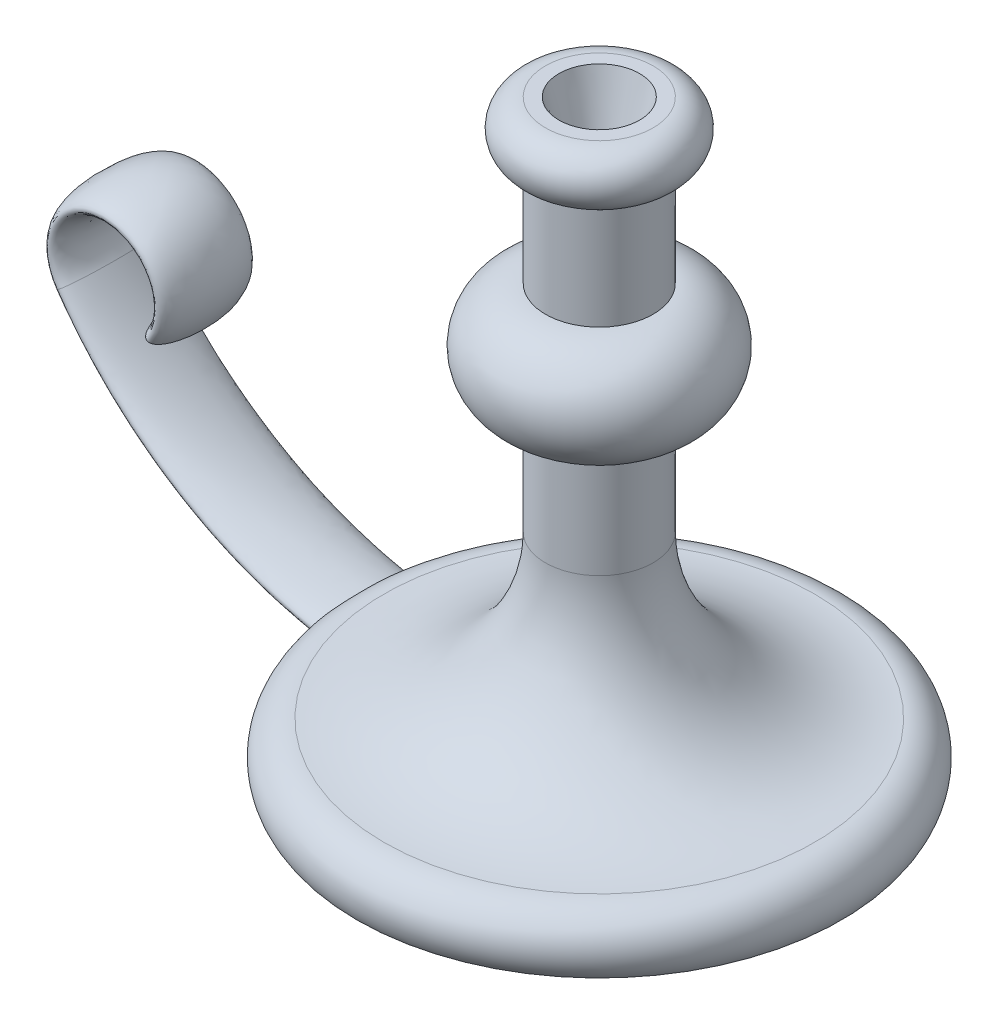
ISO-10303-21;
HEADER;
FILE_DESCRIPTION(('STEP AP214'),'2;1');
FILE_NAME('part.step','',(''),(''),'','','');
FILE_SCHEMA(('AUTOMOTIVE_DESIGN { 1 0 10303 214 1 1 1 1 }'));
ENDSEC;
DATA;
#1=APPLICATION_CONTEXT('core data for automotive mechanical design processes');
#2=APPLICATION_PROTOCOL_DEFINITION('international standard','automotive_design',2000,#1);
#3=PRODUCT_CONTEXT('',#1,'mechanical');
#4=PRODUCT('Part','Part','',(#3));
#5=PRODUCT_RELATED_PRODUCT_CATEGORY('part','',(#4));
#6=PRODUCT_DEFINITION_FORMATION('','',#4);
#7=PRODUCT_DEFINITION_CONTEXT('part definition',#1,'design');
#8=PRODUCT_DEFINITION('design','',#6,#7);
#9=PRODUCT_DEFINITION_SHAPE('','',#8);
#10=(LENGTH_UNIT() NAMED_UNIT(*) SI_UNIT(.MILLI.,.METRE.));
#11=(NAMED_UNIT(*) PLANE_ANGLE_UNIT() SI_UNIT($,.RADIAN.));
#12=(NAMED_UNIT(*) SI_UNIT($,.STERADIAN.) SOLID_ANGLE_UNIT());
#13=UNCERTAINTY_MEASURE_WITH_UNIT(LENGTH_MEASURE(1.E-05),#10,'distance_accuracy_value','');
#14=(GEOMETRIC_REPRESENTATION_CONTEXT(3) GLOBAL_UNCERTAINTY_ASSIGNED_CONTEXT((#13)) GLOBAL_UNIT_ASSIGNED_CONTEXT((#10,
#11,#12)) REPRESENTATION_CONTEXT('',''));
#15=CARTESIAN_POINT('',(0.,0.,0.));
#16=DIRECTION('',(0.,0.,1.));
#17=DIRECTION('',(1.,0.,0.));
#18=AXIS2_PLACEMENT_3D('',#15,#16,#17);
#19=CARTESIAN_POINT('',(0.,7.50000000000001,0.));
#20=DIRECTION('',(0.,-1.,0.));
#21=DIRECTION('',(0.,0.,-1.));
#22=AXIS2_PLACEMENT_3D('',#19,#20,#21);
#23=TOROIDAL_SURFACE('',#22,80.,12.5);
#24=CARTESIAN_POINT('',(0.,0.,0.));
#25=DIRECTION('',(0.,-1.,0.));
#26=DIRECTION('',(0.,0.,-1.));
#27=AXIS2_PLACEMENT_3D('',#24,#25,#26);
#28=CIRCLE('',#27,90.);
#29=CARTESIAN_POINT('',(0.,0.,-90.));
#30=VERTEX_POINT('',#29);
#31=EDGE_CURVE('E76',#30,#30,#28,.T.);
#32=ORIENTED_EDGE('',*,*,#31,.F.);
#33=EDGE_LOOP('',(#32));
#34=FACE_BOUND('',#33,.T.);
#35=CARTESIAN_POINT('',(0.,20.,0.));
#36=DIRECTION('',(0.,-1.,0.));
#37=DIRECTION('',(0.,0.,-1.));
#38=AXIS2_PLACEMENT_3D('',#35,#36,#37);
#39=CIRCLE('',#38,80.);
#40=CARTESIAN_POINT('',(0.,20.,-80.));
#41=VERTEX_POINT('',#40);
#42=EDGE_CURVE('E72',#41,#41,#39,.T.);
#43=ORIENTED_EDGE('',*,*,#42,.T.);
#44=EDGE_LOOP('',(#43));
#45=FACE_BOUND('',#44,.T.);
#46=CARTESIAN_POINT('',(-89.5597422043342,12.9414346567555,17.5));
#47=CARTESIAN_POINT('',(-89.5807278946486,12.8988393157081,17.5000019534777));
#48=CARTESIAN_POINT('',(-89.6018125795404,12.8563039357769,17.4977816975197));
#49=CARTESIAN_POINT('',(-89.6440155813563,12.771693833937,17.489002543543));
#50=CARTESIAN_POINT('',(-89.6651339056647,12.7296192360718,17.4824425050804));
#51=CARTESIAN_POINT('',(-89.7283289297819,12.6045076597417,17.4565216692094));
#52=CARTESIAN_POINT('',(-89.7702246464785,12.5226255894254,17.4309204730635));
#53=CARTESIAN_POINT('',(-89.8644276523311,12.3407735771965,17.3563532007827));
#54=CARTESIAN_POINT('',(-89.9162117483189,12.242484901666,17.3027527423027));
#55=CARTESIAN_POINT('',(-90.0163878681401,12.0551458272008,17.178826321144));
#56=CARTESIAN_POINT('',(-90.0647710548456,11.966119226993,17.1084587296403));
#57=CARTESIAN_POINT('',(-90.1524531790238,11.8069845229249,16.9652391551481));
#58=CARTESIAN_POINT('',(-90.1921458014336,11.7358878994478,16.8936963434586));
#59=CARTESIAN_POINT('',(-90.2690886261224,11.5996259068224,16.7438969488311));
#60=CARTESIAN_POINT('',(-90.3063367280021,11.5344656201532,16.665634722265));
#61=CARTESIAN_POINT('',(-90.3786756485819,11.4092540815105,16.5039763875565));
#62=CARTESIAN_POINT('',(-90.4137624747614,11.349212210629,16.4205713158719));
#63=CARTESIAN_POINT('',(-90.4819450166471,11.2336894025401,16.2499454917114));
#64=CARTESIAN_POINT('',(-90.5150413047902,11.1782071523834,16.162725848809));
#65=CARTESIAN_POINT('',(-90.5839705930101,11.0637251825689,15.9728919395737));
#66=CARTESIAN_POINT('',(-90.6195406839562,11.0053156128849,15.8698282905888));
#67=CARTESIAN_POINT('',(-90.6886668526269,10.8929143897207,15.6606649910659));
#68=CARTESIAN_POINT('',(-90.7222226971282,10.8389232475744,15.5545649910506));
#69=CARTESIAN_POINT('',(-90.787486486134,10.7348751403118,15.3401290691865));
#70=CARTESIAN_POINT('',(-90.8191972688173,10.684812089084,15.2317969483067));
#71=CARTESIAN_POINT('',(-90.881005962979,10.5880683385414,15.0131968985225));
#72=CARTESIAN_POINT('',(-90.9111039714557,10.5413874357516,14.9029290865687));
#73=CARTESIAN_POINT('',(-90.979897363352,10.4355491517098,14.6427529331226));
#74=CARTESIAN_POINT('',(-91.0180072010883,10.377593665576,14.4922012075481));
#75=CARTESIAN_POINT('',(-91.0918875553169,10.2663462891691,14.1888070722871));
#76=CARTESIAN_POINT('',(-91.1276577411367,10.2130550577558,14.0359643425398));
#77=CARTESIAN_POINT('',(-91.1971197458645,10.1105127689611,13.7282685712582));
#78=CARTESIAN_POINT('',(-91.2308091946811,10.0612662985098,13.573413471871));
#79=CARTESIAN_POINT('',(-91.2962483962878,9.96642044574794,13.262180104172));
#80=CARTESIAN_POINT('',(-91.3279980241889,9.92082129819988,13.1058017385396));
#81=CARTESIAN_POINT('',(-91.4205951755327,9.78887458660793,12.6346162266685));
#82=CARTESIAN_POINT('',(-91.4787589060981,9.7074247697959,12.3179025042442));
#83=CARTESIAN_POINT('',(-91.5890957852254,9.55493826130148,11.6792188898602));
#84=CARTESIAN_POINT('',(-91.641236506382,9.48395741425902,11.357230318611));
#85=CARTESIAN_POINT('',(-91.7397682682944,9.35136221163193,10.7107316640823));
#86=CARTESIAN_POINT('',(-91.7861636672357,9.28974074823241,10.3862236929834));
#87=CARTESIAN_POINT('',(-91.8736976604511,9.17463718318048,9.73512886653574));
#88=CARTESIAN_POINT('',(-91.9148370779328,9.12115380666532,9.4085423451682));
#89=CARTESIAN_POINT('',(-91.9930777751443,9.02031209920314,8.74630339912618));
#90=CARTESIAN_POINT('',(-92.0300669877613,8.97311921137155,8.41061269264342));
#91=CARTESIAN_POINT('',(-92.0991833927575,8.88559842477429,7.73783252743949));
#92=CARTESIAN_POINT('',(-92.1313104056235,8.84527077946747,7.40074301754615));
#93=CARTESIAN_POINT('',(-92.1909161961866,8.77092313439264,6.7253714235535));
#94=CARTESIAN_POINT('',(-92.2183937480205,8.73690479789178,6.38708904887196));
#95=CARTESIAN_POINT('',(-92.2688480816039,8.67476840304496,5.70964427774295));
#96=CARTESIAN_POINT('',(-92.2918247141674,8.64665054027188,5.37048185250304));
#97=CARTESIAN_POINT('',(-92.3540877228586,8.57076604630483,4.35367181244673));
#98=CARTESIAN_POINT('',(-92.3868571977359,8.53128338370551,3.67498389641651));
#99=CARTESIAN_POINT('',(-92.4356134743347,8.47274161832891,2.31614711504074));
#100=CARTESIAN_POINT('',(-92.4515998737812,8.4536830050971,1.63599821506828));
#101=CARTESIAN_POINT('',(-92.466120047878,8.43637339284848,0.357955102331979));
#102=CARTESIAN_POINT('',(-92.4665389208555,8.43587490179702,-0.239888856143629));
#103=CARTESIAN_POINT('',(-92.4546362797529,8.45006241260825,-1.43536153859163));
#104=CARTESIAN_POINT('',(-92.4423128974783,8.4647506410584,-2.03299021814841));
#105=CARTESIAN_POINT('',(-92.4047541650815,8.50976680779925,-3.22745109478544));
#106=CARTESIAN_POINT('',(-92.379514731688,8.54009969200433,-3.82428298010725));
#107=CARTESIAN_POINT('',(-92.3157217367253,8.61743320229672,-5.01694606233263));
#108=CARTESIAN_POINT('',(-92.2771508465328,8.66445552395915,-5.61277493756133));
#109=CARTESIAN_POINT('',(-92.1861026743767,8.77678784246252,-6.80153886380944));
#110=CARTESIAN_POINT('',(-92.1336290020919,8.84209309262495,-7.39447462535096));
#111=CARTESIAN_POINT('',(-92.0437550848418,8.95574227206708,-8.2805522982052));
#112=CARTESIAN_POINT('',(-92.0119455213755,8.9962289455201,-8.57528682166734));
#113=CARTESIAN_POINT('',(-91.9444204496405,9.08291539794885,-9.16346094428892));
#114=CARTESIAN_POINT('',(-91.9087051114864,9.12911492811454,-9.45690059926722));
#115=CARTESIAN_POINT('',(-91.8331309715697,9.22782929334065,-10.0422906036684));
#116=CARTESIAN_POINT('',(-91.7932707518513,9.28034629056379,-10.3342404073469));
#117=CARTESIAN_POINT('',(-91.7091179167369,9.39245062081628,-10.9161852811054));
#118=CARTESIAN_POINT('',(-91.6648247441272,9.45203884286027,-11.2061801005453));
#119=CARTESIAN_POINT('',(-91.571392572748,9.57931645333877,-11.783819165817));
#120=CARTESIAN_POINT('',(-91.5222504482681,9.64701107336923,-12.0714617643074));
#121=CARTESIAN_POINT('',(-91.4186796874406,9.79172730085905,-12.6430805537633));
#122=CARTESIAN_POINT('',(-91.3642572573635,9.86873798424095,-12.9270606150356));
#123=CARTESIAN_POINT('',(-91.2493765391174,10.033952974788,-13.4904217181467));
#124=CARTESIAN_POINT('',(-91.1889212109096,10.1221517983454,-13.7698049377449));
#125=CARTESIAN_POINT('',(-91.0929373870873,10.2648274882363,-14.1839125047648));
#126=CARTESIAN_POINT('',(-91.0600757486262,10.3140904181849,-14.3210581267388));
#127=CARTESIAN_POINT('',(-90.9923938569386,10.4165511027192,-14.593376347765));
#128=CARTESIAN_POINT('',(-90.9575737807135,10.4697485018483,-14.7285491237346));
#129=CARTESIAN_POINT('',(-90.8810851838776,10.5878451344079,-15.0138774923679));
#130=CARTESIAN_POINT('',(-90.8391147723957,10.6533666208412,-15.1636969104749));
#131=CARTESIAN_POINT('',(-90.7519625692612,10.7912189771815,-15.4593295355901));
#132=CARTESIAN_POINT('',(-90.7067794219568,10.8635527258308,-15.605141014985));
#133=CARTESIAN_POINT('',(-90.6128939496974,11.0160439629677,-15.8905749729623));
#134=CARTESIAN_POINT('',(-90.5642084544311,11.0961646105685,-16.0302224467125));
#135=CARTESIAN_POINT('',(-90.4624897667354,11.2662530107872,-16.3016394850687));
#136=CARTESIAN_POINT('',(-90.4094613083907,11.3562100760681,-16.4334173639363));
#137=CARTESIAN_POINT('',(-90.3114276481005,11.5255085385047,-16.6553108138959));
#138=CARTESIAN_POINT('',(-90.2675273757817,11.6022608890605,-16.747864447136));
#139=CARTESIAN_POINT('',(-90.1761749534327,11.7643292238686,-16.9236630994732));
#140=CARTESIAN_POINT('',(-90.1287172073379,11.849658775493,-17.0068929161981));
#141=CARTESIAN_POINT('',(-90.0292807633427,12.0313291797368,-17.160728121925));
#142=CARTESIAN_POINT('',(-89.9772518064338,12.1277974407354,-17.2311575389091));
#143=CARTESIAN_POINT('',(-89.8965437818878,12.2800613987941,-17.3212876850735));
#144=CARTESIAN_POINT('',(-89.8692277989253,12.3320164153137,-17.3487242132161));
#145=CARTESIAN_POINT('',(-89.8138320311431,12.4382955168478,-17.397521114568));
#146=CARTESIAN_POINT('',(-89.7857527202502,12.4926181439798,-17.4188851676711));
#147=CARTESIAN_POINT('',(-89.7185869780336,12.6237048005599,-17.4611772226903));
#148=CARTESIAN_POINT('',(-89.6792533408886,12.7013692224276,-17.4790502108363));
#149=CARTESIAN_POINT('',(-89.6005512815564,12.8586256339485,-17.4997317533413));
#150=CARTESIAN_POINT('',(-89.5611829132233,12.9382160139949,-17.5025524785485));
#151=CARTESIAN_POINT('',(-89.4835317885697,13.0969633423244,-17.4927372657774));
#152=CARTESIAN_POINT('',(-89.4452490812937,13.1761202708964,-17.4801006306501));
#153=CARTESIAN_POINT('',(-89.3707047667355,13.3318071774563,-17.440649407729));
#154=CARTESIAN_POINT('',(-89.3344452993772,13.4083343423531,-17.4138201116179));
#155=CARTESIAN_POINT('',(-89.2510611220235,13.5858554385683,-17.3357126521072));
#156=CARTESIAN_POINT('',(-89.2050998650832,13.684982377722,-17.2790047620841));
#157=CARTESIAN_POINT('',(-89.1180744174556,13.8744276311819,-17.1491670423826));
#158=CARTESIAN_POINT('',(-89.0770301058259,13.9647099356686,-17.0759737821298));
#159=CARTESIAN_POINT('',(-89.0037033744711,14.1271434857571,-16.9270577307039));
#160=CARTESIAN_POINT('',(-88.9709541551903,14.2001945680732,-16.8525208708986));
#161=CARTESIAN_POINT('',(-88.908496842619,14.3401811690449,-16.697029269211));
#162=CARTESIAN_POINT('',(-88.8787841266134,14.4071259665769,-16.6160846261892));
#163=CARTESIAN_POINT('',(-88.8217814388549,14.5359995630883,-16.4490709627677));
#164=CARTESIAN_POINT('',(-88.7944998605826,14.5979109242412,-16.362985782321));
#165=CARTESIAN_POINT('',(-88.7420667437369,14.717173406466,-16.187069787363));
#166=CARTESIAN_POINT('',(-88.7169159331092,14.7745229686601,-16.097237708295));
#167=CARTESIAN_POINT('',(-88.6682699235336,14.8855899090513,-15.9140699306461));
#168=CARTESIAN_POINT('',(-88.6447869137156,14.9392804489426,-15.8207148279058));
#169=CARTESIAN_POINT('',(-88.5993971939427,15.0431008843882,-15.6316626961432));
#170=CARTESIAN_POINT('',(-88.5774907604158,15.0932301555102,-15.5359652603523));
#171=CARTESIAN_POINT('',(-88.513751478622,15.2390285874187,-15.2458062448786));
#172=CARTESIAN_POINT('',(-88.4739596847913,15.329968547736,-15.0485147207846));
#173=CARTESIAN_POINT('',(-88.3985337506615,15.5017775203626,-14.6487152633386));
#174=CARTESIAN_POINT('',(-88.3629029634839,15.5826384140041,-14.4462032813472));
#175=CARTESIAN_POINT('',(-88.2948356711212,15.7363066128672,-14.0365764701687));
#176=CARTESIAN_POINT('',(-88.2624142295169,15.8090761199817,-13.8294450545347));
#177=CARTESIAN_POINT('',(-88.2003835751381,15.9473648801957,-13.4126289871757));
#178=CARTESIAN_POINT('',(-88.1707714189814,16.0128917338223,-13.2029472733579));
#179=CARTESIAN_POINT('',(-88.1139049361937,16.1377375745622,-12.7814949946297));
#180=CARTESIAN_POINT('',(-88.0866500408508,16.1970580597505,-12.5697249473623));
#181=CARTESIAN_POINT('',(-88.0276172572029,16.3244235662306,-12.0912931700773));
#182=CARTESIAN_POINT('',(-87.9964138193044,16.3909381265496,-11.8241540502338));
#183=CARTESIAN_POINT('',(-87.9367717636617,16.5165936764721,-11.2878278414642));
#184=CARTESIAN_POINT('',(-87.9083334164421,16.5757339447662,-11.0186405549266));
#185=CARTESIAN_POINT('',(-87.8539266282972,16.6875098948958,-10.4785408424874));
#186=CARTESIAN_POINT('',(-87.8279593730487,16.7401424577996,-10.2076276543184));
#187=CARTESIAN_POINT('',(-87.7783184309331,16.8395301522938,-9.66451167999733));
#188=CARTESIAN_POINT('',(-87.7546448506396,16.8862850108119,-9.39230883453826));
#189=CARTESIAN_POINT('',(-87.6869994555325,17.0182803050949,-8.57578965921681));
#190=CARTESIAN_POINT('',(-87.6462388525846,17.0955854003689,-8.0299116722534));
#191=CARTESIAN_POINT('',(-87.5728065515611,17.2320145687304,-6.93552385093875));
#192=CARTESIAN_POINT('',(-87.5401330675682,17.2911426566329,-6.38701462497957));
#193=CARTESIAN_POINT('',(-87.4828441952971,17.3930876120976,-5.2895588485076));
#194=CARTESIAN_POINT('',(-87.4582074588681,17.4359477429324,-4.74061740412407));
#195=CARTESIAN_POINT('',(-87.4169410999172,17.5068884934702,-3.64146108218586));
#196=CARTESIAN_POINT('',(-87.4003119088602,17.534968316784,-3.09124613761673));
#197=CARTESIAN_POINT('',(-87.3751699481989,17.5771566462025,-1.98980868969094));
#198=CARTESIAN_POINT('',(-87.3666614689744,17.5912577671532,-1.43858580772002));
#199=CARTESIAN_POINT('',(-87.3578539704596,17.6058511840595,-0.335909067644268));
#200=CARTESIAN_POINT('',(-87.3575547550007,17.6063438052041,0.2155447846264));
#201=CARTESIAN_POINT('',(-87.3651677510508,17.5937352162512,1.31815822776357));
#202=CARTESIAN_POINT('',(-87.3730787250644,17.5806360547995,1.86931785045211));
#203=CARTESIAN_POINT('',(-87.3970372477743,17.5404868292746,2.97097544677848));
#204=CARTESIAN_POINT('',(-87.4130850653539,17.5134363041759,3.52147339794866));
#205=CARTESIAN_POINT('',(-87.4531996813082,17.4446213827574,4.62112135666927));
#206=CARTESIAN_POINT('',(-87.4772644593793,17.4028606933018,5.17027166874281));
#207=CARTESIAN_POINT('',(-87.5333316774062,17.3033707612729,6.26670053623678));
#208=CARTESIAN_POINT('',(-87.5653334299483,17.2456429015513,6.81397924959532));
#209=CARTESIAN_POINT('',(-87.6208220531232,17.1429049509082,7.65503321383913));
#210=CARTESIAN_POINT('',(-87.6414679669261,17.1042333246738,7.94978028809036));
#211=CARTESIAN_POINT('',(-87.6851649593458,17.0212250701551,8.53829462762367));
#212=CARTESIAN_POINT('',(-87.7082159678752,16.9768886069424,8.83206192120039));
#213=CARTESIAN_POINT('',(-87.7568106691339,16.8820510369677,9.41827197237023));
#214=CARTESIAN_POINT('',(-87.7823533406003,16.8315524537743,9.71071522164969));
#215=CARTESIAN_POINT('',(-87.8360989952267,16.7237193681046,10.2940938312764));
#216=CARTESIAN_POINT('',(-87.8643018909559,16.6663850902738,10.5850292408489));
#217=CARTESIAN_POINT('',(-87.9147712499549,16.5622842610502,11.0784529887236));
#218=CARTESIAN_POINT('',(-87.9362980252956,16.5174691899787,11.2814293835347));
#219=CARTESIAN_POINT('',(-87.9809118301305,16.4236835134748,11.6862455623087));
#220=CARTESIAN_POINT('',(-88.0039988123355,16.37471303398,11.8880853805203));
#221=CARTESIAN_POINT('',(-88.0519198244944,16.2721215384757,12.2905621648854));
#222=CARTESIAN_POINT('',(-88.0767553337325,16.2184965755427,12.4911979528423));
#223=CARTESIAN_POINT('',(-88.1283787004669,16.1060707847336,12.8907612736847));
#224=CARTESIAN_POINT('',(-88.1551664933025,16.0472701282661,13.0896888629029));
#225=CARTESIAN_POINT('',(-88.2109999780506,15.9237718205574,13.4854201231418));
#226=CARTESIAN_POINT('',(-88.240045919486,15.8590735174962,13.6822235567018));
#227=CARTESIAN_POINT('',(-88.3008027999434,15.7228691935849,14.0730419872904));
#228=CARTESIAN_POINT('',(-88.3325134779586,15.6513638393841,14.2670572552408));
#229=CARTESIAN_POINT('',(-88.3991424541962,15.5003948115855,14.6511973591145));
#230=CARTESIAN_POINT('',(-88.4340575115818,15.4209391715422,14.8413258930668));
#231=CARTESIAN_POINT('',(-88.507919608305,15.2523848762561,15.2164401400177));
#232=CARTESIAN_POINT('',(-88.5468648114131,15.1632906117645,15.4014281468499));
#233=CARTESIAN_POINT('',(-88.6092096238853,15.0206579718865,15.673311422965));
#234=CARTESIAN_POINT('',(-88.6306485895103,14.9716086740021,15.7630166800378));
#235=CARTESIAN_POINT('',(-88.6750422753314,14.8701248615217,15.9401002079379));
#236=CARTESIAN_POINT('',(-88.6979967332499,14.8176909327195,16.0274788777604));
#237=CARTESIAN_POINT('',(-88.7456840101801,14.7089478844271,16.1993887567137));
#238=CARTESIAN_POINT('',(-88.7704179688272,14.6526362825889,16.2839180892546));
#239=CARTESIAN_POINT('',(-88.821948485748,14.5356422617903,16.4492391224756));
#240=CARTESIAN_POINT('',(-88.8487445345049,14.4749609227743,16.5300317386032));
#241=CARTESIAN_POINT('',(-88.8976102788188,14.3647434848948,16.6667168433051));
#242=CARTESIAN_POINT('',(-88.9191374191611,14.3163230322079,16.7236955334947));
#243=CARTESIAN_POINT('',(-88.963708067647,14.2164452982156,16.8342912802675));
#244=CARTESIAN_POINT('',(-88.9867519478515,14.1649872721061,16.8879075056818));
#245=CARTESIAN_POINT('',(-89.0583610181502,14.0058008216795,17.0423310846557));
#246=CARTESIAN_POINT('',(-89.1095289234106,13.8929758416954,17.1370796109726));
#247=CARTESIAN_POINT('',(-89.1999001554576,13.6963386208971,17.2707956184666));
#248=CARTESIAN_POINT('',(-89.2367505169323,13.616764487968,17.3175503480631));
#249=CARTESIAN_POINT('',(-89.3136877653852,13.4522974166008,17.3968468737187));
#250=CARTESIAN_POINT('',(-89.3537667767868,13.3674175273962,17.4294220837182));
#251=CARTESIAN_POINT('',(-89.4217091217894,13.2251848973539,17.4685967336684));
#252=CARTESIAN_POINT('',(-89.4488093840981,13.1688551716174,17.4803204652976));
#253=CARTESIAN_POINT('',(-89.503794774035,13.055459493497,17.4960211898048));
#254=CARTESIAN_POINT('',(-89.5316799819,12.998393466174,17.499997387795));
#255=CARTESIAN_POINT('',(-89.5597422043342,12.9414346567555,17.5));
#256=B_SPLINE_CURVE_WITH_KNOTS('',3,(#46,#47,#48,#49,#50,#51,#52,#53,#54,#55,#56,#57,#58,#59,
#60,#61,#62,#63,#64,#65,#66,#67,#68,#69,#70,#71,#72,#73,#74,#75,#76,#77,#78,#79,#80,#81,#82,#83,
#84,#85,#86,#87,#88,#89,#90,#91,#92,#93,#94,#95,#96,#97,#98,#99,#100,#101,#102,#103,#104,#105,
#106,#107,#108,#109,#110,#111,#112,#113,#114,#115,#116,#117,#118,#119,#120,#121,#122,#123,#124,
#125,#126,#127,#128,#129,#130,#131,#132,#133,#134,#135,#136,#137,#138,#139,#140,#141,#142,#143,
#144,#145,#146,#147,#148,#149,#150,#151,#152,#153,#154,#155,#156,#157,#158,#159,#160,#161,#162,
#163,#164,#165,#166,#167,#168,#169,#170,#171,#172,#173,#174,#175,#176,#177,#178,#179,#180,#181,
#182,#183,#184,#185,#186,#187,#188,#189,#190,#191,#192,#193,#194,#195,#196,#197,#198,#199,#200,
#201,#202,#203,#204,#205,#206,#207,#208,#209,#210,#211,#212,#213,#214,#215,#216,#217,#218,#219,
#220,#221,#222,#223,#224,#225,#226,#227,#228,#229,#230,#231,#232,#233,#234,#235,#236,#237,#238,
#239,#240,#241,#242,#243,#244,#245,#246,#247,#248,#249,#250,#251,#252,#253,#254,#255),
.UNSPECIFIED.,.T.,.F.,(4,2,2,2,2,2,2,2,2,2,2,2,2,2,2,2,2,2,2,2,2,2,2,2,2,2,2,2,2,2,2,2,2,2,2,2,
2,2,2,2,2,2,2,2,2,2,2,2,2,2,2,2,2,2,2,2,2,2,2,2,2,2,2,2,2,2,2,2,2,2,2,2,2,2,2,2,2,2,2,2,2,2,2,2,
2,2,2,2,2,2,2,2,2,2,2,2,2,2,2,2,2,2,2,2,4),(0.,0.142381357158814,0.284800145338796,
0.569778369710366,0.937790990160487,1.306726997976,1.63143353328549,1.95641550824167,
2.28198085179472,2.60745211744526,2.97835758825743,3.34930592253138,3.71966767593571,
4.0900071293106,4.58717127025773,5.08440552627599,5.58219609730417,6.080018683222,
7.07612740491145,8.07737111401413,9.07785060328473,10.0781732018629,11.1010679437462,
12.1240004418369,13.1472022244407,14.1704379160042,16.2117115539474,18.2530341182272,
20.0462457692419,21.839720367684,23.6337623045227,25.4301450150665,27.2260617741975,
28.1235892294178,29.0210776087004,29.9188740333848,30.8167834514323,31.7152755049922,
32.6127240115719,33.5097343419005,33.9578247270816,34.405874679233,34.9121604747939,
35.418661186117,35.9228725276492,36.4265413835618,36.8100240505595,37.1941231504199,
37.5831580539592,37.7772586450042,37.9712413599168,38.2366258142318,38.50179565338,
38.766977452507,39.0324346081148,39.3996555983549,39.7683144393122,40.0959866375241,
40.4231523204129,40.7514069982214,41.0797733710078,41.4103344436381,41.7409533344655,
42.4030339566273,43.0656444835736,43.7312306850955,44.3961116446159,45.0608317450508,
45.8918608553084,46.7229711882506,47.5544783139764,48.3860240564158,50.0440426041185,
51.7016946763021,53.3549069476197,55.0082082878463,56.6623826267347,58.3165174374193,
59.9704029618937,61.6243431428218,63.2778668395651,64.9312473761686,65.8251617717424,
66.7190501248709,67.6125736254225,68.506067769685,69.1329546330679,69.7598225042305,
70.3872272415102,71.0146112082223,71.6420645989523,72.2694566030668,72.896220926346,
73.5227009279525,73.83601751984,74.1492800292304,74.4627449766599,74.7761327179494,
75.0094189443193,75.2427626113345,75.708018639222,76.0052441465115,76.3017654013243,
76.492139288552,76.6825327068869),.UNSPECIFIED.);
#257=CARTESIAN_POINT('',(-89.5597422043342,12.9414346567555,17.5));
#258=VERTEX_POINT('',#257);
#259=EDGE_CURVE('E43',#258,#258,#256,.T.);
#260=ORIENTED_EDGE('',*,*,#259,.T.);
#261=EDGE_LOOP('',(#260));
#262=FACE_BOUND('',#261,.T.);
#263=ADVANCED_FACE('F39',(#34,#45,#262),#23,.T.);
#264=CARTESIAN_POINT('',(0.,220.,0.));
#265=DIRECTION('',(0.,1.,0.));
#266=DIRECTION('',(0.,0.,1.));
#267=AXIS2_PLACEMENT_3D('',#264,#265,#266);
#268=PLANE('',#267);
#269=CARTESIAN_POINT('',(0.,220.,0.));
#270=DIRECTION('',(0.,1.,0.));
#271=DIRECTION('',(0.,0.,1.));
#272=AXIS2_PLACEMENT_3D('',#269,#270,#271);
#273=CIRCLE('',#272,15.);
#274=CARTESIAN_POINT('',(0.,220.,15.));
#275=VERTEX_POINT('',#274);
#276=EDGE_CURVE('E92',#275,#275,#273,.T.);
#277=ORIENTED_EDGE('',*,*,#276,.F.);
#278=EDGE_LOOP('',(#277));
#279=FACE_BOUND('',#278,.T.);
#280=CARTESIAN_POINT('',(0.,220.,0.));
#281=DIRECTION('',(0.,-1.,0.));
#282=DIRECTION('',(0.,0.,-1.));
#283=AXIS2_PLACEMENT_3D('',#280,#281,#282);
#284=CIRCLE('',#283,20.);
#285=CARTESIAN_POINT('',(0.,220.,-20.));
#286=VERTEX_POINT('',#285);
#287=EDGE_CURVE('E10',#286,#286,#284,.T.);
#288=ORIENTED_EDGE('',*,*,#287,.F.);
#289=EDGE_LOOP('',(#288));
#290=FACE_BOUND('',#289,.T.);
#291=ADVANCED_FACE('F41',(#279,#290),#268,.T.);
#292=CARTESIAN_POINT('',(0.,210.,0.));
#293=DIRECTION('',(0.,-1.,0.));
#294=DIRECTION('',(0.,0.,-1.));
#295=AXIS2_PLACEMENT_3D('',#292,#293,#294);
#296=TOROIDAL_SURFACE('',#295,20.,9.99999999999999);
#297=ORIENTED_EDGE('',*,*,#287,.T.);
#298=EDGE_LOOP('',(#297));
#299=FACE_BOUND('',#298,.T.);
#300=CARTESIAN_POINT('',(0.,200.,0.));
#301=DIRECTION('',(0.,-1.,0.));
#302=DIRECTION('',(0.,0.,-1.));
#303=AXIS2_PLACEMENT_3D('',#300,#301,#302);
#304=CIRCLE('',#303,20.);
#305=CARTESIAN_POINT('',(0.,200.,-20.));
#306=VERTEX_POINT('',#305);
#307=EDGE_CURVE('E53',#306,#306,#304,.T.);
#308=ORIENTED_EDGE('',*,*,#307,.F.);
#309=EDGE_LOOP('',(#308));
#310=FACE_BOUND('',#309,.T.);
#311=ADVANCED_FACE('F101',(#299,#310),#296,.T.);
#312=CARTESIAN_POINT('',(0.,0.,0.));
#313=DIRECTION('',(0.,-1.,0.));
#314=DIRECTION('',(0.,0.,-1.));
#315=AXIS2_PLACEMENT_3D('',#312,#313,#314);
#316=CYLINDRICAL_SURFACE('',#315,20.);
#317=ORIENTED_EDGE('',*,*,#307,.T.);
#318=EDGE_LOOP('',(#317));
#319=FACE_BOUND('',#318,.T.);
#320=CARTESIAN_POINT('',(0.,160.,0.));
#321=DIRECTION('',(0.,-1.,0.));
#322=DIRECTION('',(0.,0.,-1.));
#323=AXIS2_PLACEMENT_3D('',#320,#321,#322);
#324=CIRCLE('',#323,20.);
#325=CARTESIAN_POINT('',(0.,160.,-20.));
#326=VERTEX_POINT('',#325);
#327=EDGE_CURVE('E58',#326,#326,#324,.T.);
#328=ORIENTED_EDGE('',*,*,#327,.F.);
#329=EDGE_LOOP('',(#328));
#330=FACE_BOUND('',#329,.T.);
#331=ADVANCED_FACE('F106',(#319,#330),#316,.T.);
#332=CARTESIAN_POINT('',(0.,140.,0.));
#333=DIRECTION('',(0.,-1.,0.));
#334=DIRECTION('',(0.,0.,-1.));
#335=AXIS2_PLACEMENT_3D('',#332,#333,#334);
#336=TOROIDAL_SURFACE('',#335,20.,20.);
#337=ORIENTED_EDGE('',*,*,#327,.T.);
#338=EDGE_LOOP('',(#337));
#339=FACE_BOUND('',#338,.T.);
#340=CARTESIAN_POINT('',(0.,120.,0.));
#341=DIRECTION('',(0.,-1.,0.));
#342=DIRECTION('',(0.,0.,-1.));
#343=AXIS2_PLACEMENT_3D('',#340,#341,#342);
#344=CIRCLE('',#343,20.);
#345=CARTESIAN_POINT('',(0.,120.,-20.));
#346=VERTEX_POINT('',#345);
#347=EDGE_CURVE('E64',#346,#346,#344,.T.);
#348=ORIENTED_EDGE('',*,*,#347,.F.);
#349=EDGE_LOOP('',(#348));
#350=FACE_BOUND('',#349,.T.);
#351=ADVANCED_FACE('F124',(#339,#350),#336,.T.);
#352=CARTESIAN_POINT('',(0.,0.,0.));
#353=DIRECTION('',(0.,-1.,0.));
#354=DIRECTION('',(0.,0.,-1.));
#355=AXIS2_PLACEMENT_3D('',#352,#353,#354);
#356=CYLINDRICAL_SURFACE('',#355,20.);
#357=ORIENTED_EDGE('',*,*,#347,.T.);
#358=EDGE_LOOP('',(#357));
#359=FACE_BOUND('',#358,.T.);
#360=CARTESIAN_POINT('',(0.,80.,0.));
#361=DIRECTION('',(0.,-1.,0.));
#362=DIRECTION('',(0.,0.,-1.));
#363=AXIS2_PLACEMENT_3D('',#360,#361,#362);
#364=CIRCLE('',#363,20.);
#365=CARTESIAN_POINT('',(0.,80.,-20.));
#366=VERTEX_POINT('',#365);
#367=EDGE_CURVE('E68',#366,#366,#364,.T.);
#368=ORIENTED_EDGE('',*,*,#367,.F.);
#369=EDGE_LOOP('',(#368));
#370=FACE_BOUND('',#369,.T.);
#371=ADVANCED_FACE('F120',(#359,#370),#356,.T.);
#372=CARTESIAN_POINT('',(0.,80.,0.));
#373=DIRECTION('',(0.,-1.,0.));
#374=DIRECTION('',(0.,0.,-1.));
#375=AXIS2_PLACEMENT_3D('',#372,#373,#374);
#376=TOROIDAL_SURFACE('',#375,80.,60.);
#377=ORIENTED_EDGE('',*,*,#367,.T.);
#378=EDGE_LOOP('',(#377));
#379=FACE_BOUND('',#378,.T.);
#380=ORIENTED_EDGE('',*,*,#42,.F.);
#381=EDGE_LOOP('',(#380));
#382=FACE_BOUND('',#381,.T.);
#383=ADVANCED_FACE('F117',(#379,#382),#376,.F.);
#384=CARTESIAN_POINT('',(90.,0.,0.));
#385=DIRECTION('',(0.,-1.,0.));
#386=DIRECTION('',(0.,0.,-1.));
#387=AXIS2_PLACEMENT_3D('',#384,#385,#386);
#388=PLANE('',#387);
#389=ORIENTED_EDGE('',*,*,#31,.T.);
#390=EDGE_LOOP('',(#389));
#391=FACE_BOUND('',#390,.T.);
#392=ADVANCED_FACE('F115',(#391),#388,.T.);
#393=CARTESIAN_POINT('',(-150.634185358261,75.,0.));
#394=DIRECTION('',(0.566666666666665,0.823947139620553,0.));
#395=DIRECTION('',(0.,0.,-1.));
#396=AXIS2_PLACEMENT_3D('',#393,#394,#395);
#397=PLANE('',#396);
#398=CARTESIAN_POINT('',(-150.634185358261,75.,0.));
#399=DIRECTION('',(0.566666666666665,0.823947139620553,0.));
#400=DIRECTION('',(0.,0.,1.));
#401=AXIS2_PLACEMENT_3D('',#398,#399,#400);
#402=ELLIPSE('',#401,17.5,5.);
#403=CARTESIAN_POINT('',(-150.634185358261,75.,17.5));
#404=VERTEX_POINT('',#403);
#405=EDGE_CURVE('E80',#404,#404,#402,.T.);
#406=ORIENTED_EDGE('',*,*,#405,.F.);
#407=EDGE_LOOP('',(#406));
#408=FACE_BOUND('',#407,.T.);
#409=ADVANCED_FACE('F151',(#408),#397,.F.);
#410=CARTESIAN_POINT('',(-60.,9.99999999999998,17.5));
#411=CARTESIAN_POINT('',(-110.410191303973,9.99999999999997,17.5));
#412=CARTESIAN_POINT('',(-155.026295870831,33.4646670673664,17.5));
#413=CARTESIAN_POINT('',(-183.592070943083,74.9999999999999,17.5));
#414=CARTESIAN_POINT('',(-60.,0.,17.5));
#415=CARTESIAN_POINT('',(-113.770870724238,0.,17.5));
#416=CARTESIAN_POINT('',(-161.36138226222,25.0289782051908,17.5));
#417=CARTESIAN_POINT('',(-191.831542339288,69.3333333333332,17.5));
#418=CARTESIAN_POINT('',(-60.,0.,-17.5));
#419=CARTESIAN_POINT('',(-113.770870724238,0.,-17.5));
#420=CARTESIAN_POINT('',(-161.36138226222,25.0289782051908,-17.5));
#421=CARTESIAN_POINT('',(-191.831542339288,69.3333333333332,-17.5));
#422=CARTESIAN_POINT('',(-60.,9.99999999999998,-17.5));
#423=CARTESIAN_POINT('',(-110.410191303973,9.99999999999997,-17.5));
#424=CARTESIAN_POINT('',(-155.026295870831,33.4646670673664,-17.5));
#425=CARTESIAN_POINT('',(-183.592070943083,74.9999999999999,-17.5));
#426=CARTESIAN_POINT('',(-60.,20.,-17.5));
#427=CARTESIAN_POINT('',(-107.049511883708,20.,-17.5));
#428=CARTESIAN_POINT('',(-148.691209479443,41.900355929542,-17.5));
#429=CARTESIAN_POINT('',(-175.352599546877,80.6666666666666,-17.5));
#430=CARTESIAN_POINT('',(-60.,20.,17.5));
#431=CARTESIAN_POINT('',(-107.049511883708,20.,17.5));
#432=CARTESIAN_POINT('',(-148.691209479443,41.900355929542,17.5));
#433=CARTESIAN_POINT('',(-175.352599546877,80.6666666666666,17.5));
#434=CARTESIAN_POINT('',(-60.,9.99999999999998,17.5));
#435=CARTESIAN_POINT('',(-110.410191303973,9.99999999999997,17.5));
#436=CARTESIAN_POINT('',(-155.026295870831,33.4646670673664,17.5));
#437=CARTESIAN_POINT('',(-183.592070943083,74.9999999999999,17.5));
#438=(BOUNDED_SURFACE() B_SPLINE_SURFACE(3,3,((#410,#411,#412,#413),(#414,#415,#416,#417),(#418,
#419,#420,#421),(#422,#423,#424,#425),(#426,#427,#428,#429),(#430,#431,#432,#433),(#434,#435,
#436,#437)),.UNSPECIFIED.,.T.,.F.,.F.) B_SPLINE_SURFACE_WITH_KNOTS((4,3,4),(4,4),(0.,0.5,1.),
(0.,1.),.UNSPECIFIED.) GEOMETRIC_REPRESENTATION_ITEM() RATIONAL_B_SPLINE_SURFACE(((1.,
0.923374135437856,0.923374135437856,1.),(0.333333333333333,0.307791378479285,0.307791378479285,
0.333333333333333),(0.333333333333333,0.307791378479285,0.307791378479285,0.333333333333333),
(1.,0.923374135437856,0.923374135437856,1.),(0.333333333333333,0.307791378479285,
0.307791378479285,0.333333333333333),(0.333333333333333,0.307791378479285,0.307791378479285,
0.333333333333333),(1.,0.923374135437856,0.923374135437856,1.))) REPRESENTATION_ITEM('') SURFACE());
#439=CARTESIAN_POINT('',(-183.592070943083,74.9999999999999,0.));
#440=DIRECTION('',(0.566666666666668,-0.823947139620551,0.));
#441=DIRECTION('',(0.,0.,1.));
#442=AXIS2_PLACEMENT_3D('',#439,#440,#441);
#443=ELLIPSE('',#442,17.5,5.);
#444=CARTESIAN_POINT('',(-183.592070943083,74.9999999999999,17.5));
#445=VERTEX_POINT('',#444);
#446=EDGE_CURVE('E84',#445,#445,#443,.T.);
#447=ORIENTED_EDGE('',*,*,#259,.F.);
#448=EDGE_LOOP('',(#447));
#449=FACE_BOUND('',#448,.T.);
#450=ORIENTED_EDGE('',*,*,#446,.T.);
#451=EDGE_LOOP('',(#450));
#452=FACE_BOUND('',#451,.T.);
#453=ADVANCED_FACE('F147',(#449,#452),#438,.F.);
#454=CARTESIAN_POINT('',(-183.592070943083,74.9999999999999,17.5));
#455=CARTESIAN_POINT('',(-193.981461744242,90.1064273523799,17.5));
#456=CARTESIAN_POINT('',(-185.447347211541,106.333333333333,17.5));
#457=CARTESIAN_POINT('',(-167.113128150672,106.333333333333,17.5));
#458=CARTESIAN_POINT('',(-148.778909089802,106.333333333333,17.5));
#459=CARTESIAN_POINT('',(-140.244794557101,90.10642735238,17.5));
#460=CARTESIAN_POINT('',(-150.634185358261,74.9999999999999,17.5));
#461=CARTESIAN_POINT('',(-191.831542339288,69.3333333333332,17.5));
#462=CARTESIAN_POINT('',(-207.415628541027,91.9929743619033,17.5));
#463=CARTESIAN_POINT('',(-194.614456741976,116.333333333333,17.5));
#464=CARTESIAN_POINT('',(-167.113128150672,116.333333333333,17.5));
#465=CARTESIAN_POINT('',(-139.611799559367,116.333333333333,17.5));
#466=CARTESIAN_POINT('',(-126.810627760316,91.9929743619034,17.5));
#467=CARTESIAN_POINT('',(-142.394713962055,69.3333333333333,17.5));
#468=CARTESIAN_POINT('',(-191.831542339288,69.3333333333332,-17.5));
#469=CARTESIAN_POINT('',(-207.415628541027,91.9929743619033,-17.5));
#470=CARTESIAN_POINT('',(-194.614456741976,116.333333333333,-17.5));
#471=CARTESIAN_POINT('',(-167.113128150672,116.333333333333,-17.5));
#472=CARTESIAN_POINT('',(-139.611799559367,116.333333333333,-17.5));
#473=CARTESIAN_POINT('',(-126.810627760316,91.9929743619034,-17.5));
#474=CARTESIAN_POINT('',(-142.394713962055,69.3333333333333,-17.5));
#475=CARTESIAN_POINT('',(-183.592070943083,74.9999999999999,-17.5));
#476=CARTESIAN_POINT('',(-193.981461744242,90.1064273523799,-17.5));
#477=CARTESIAN_POINT('',(-185.447347211541,106.333333333333,-17.5));
#478=CARTESIAN_POINT('',(-167.113128150672,106.333333333333,-17.5));
#479=CARTESIAN_POINT('',(-148.778909089802,106.333333333333,-17.5));
#480=CARTESIAN_POINT('',(-140.244794557101,90.10642735238,-17.5));
#481=CARTESIAN_POINT('',(-150.634185358261,74.9999999999999,-17.5));
#482=CARTESIAN_POINT('',(-175.352599546877,80.6666666666666,-17.5));
#483=CARTESIAN_POINT('',(-180.547294947457,88.2198803428566,-17.5));
#484=CARTESIAN_POINT('',(-176.280237681106,96.3333333333333,-17.5));
#485=CARTESIAN_POINT('',(-167.113128150672,96.3333333333333,-17.5));
#486=CARTESIAN_POINT('',(-157.946018620237,96.3333333333333,-17.5));
#487=CARTESIAN_POINT('',(-153.678961353886,88.2198803428566,-17.5));
#488=CARTESIAN_POINT('',(-158.873656754466,80.6666666666666,-17.5));
#489=CARTESIAN_POINT('',(-175.352599546877,80.6666666666666,17.5));
#490=CARTESIAN_POINT('',(-180.547294947457,88.2198803428566,17.5));
#491=CARTESIAN_POINT('',(-176.280237681106,96.3333333333333,17.5));
#492=CARTESIAN_POINT('',(-167.113128150672,96.3333333333333,17.5));
#493=CARTESIAN_POINT('',(-157.946018620237,96.3333333333333,17.5));
#494=CARTESIAN_POINT('',(-153.678961353886,88.2198803428566,17.5));
#495=CARTESIAN_POINT('',(-158.873656754466,80.6666666666666,17.5));
#496=CARTESIAN_POINT('',(-183.592070943083,74.9999999999999,17.5));
#497=CARTESIAN_POINT('',(-193.981461744242,90.1064273523799,17.5));
#498=CARTESIAN_POINT('',(-185.447347211541,106.333333333333,17.5));
#499=CARTESIAN_POINT('',(-167.113128150672,106.333333333333,17.5));
#500=CARTESIAN_POINT('',(-148.778909089802,106.333333333333,17.5));
#501=CARTESIAN_POINT('',(-140.244794557101,90.10642735238,17.5));
#502=CARTESIAN_POINT('',(-150.634185358261,74.9999999999999,17.5));
#503=(BOUNDED_SURFACE() B_SPLINE_SURFACE(3,3,((#454,#455,#456,#457,#458,#459,#460),(#461,#462,
#463,#464,#465,#466,#467),(#468,#469,#470,#471,#472,#473,#474),(#475,#476,#477,#478,#479,#480,
#481),(#482,#483,#484,#485,#486,#487,#488),(#489,#490,#491,#492,#493,#494,#495),(#496,#497,#498,
#499,#500,#501,#502)),.UNSPECIFIED.,.T.,.F.,.F.) B_SPLINE_SURFACE_WITH_KNOTS((4,3,4),(4,3,4),
(0.,0.5,1.),(0.,0.5,1.),
.UNSPECIFIED.) GEOMETRIC_REPRESENTATION_ITEM() RATIONAL_B_SPLINE_SURFACE(((1.,0.643649778750421,
0.643649778750421,1.,0.643649778750421,0.643649778750421,1.),(0.333333333333333,
0.21454992625014,0.21454992625014,0.333333333333333,0.21454992625014,0.21454992625014,
0.333333333333333),(0.333333333333333,0.21454992625014,0.21454992625014,0.333333333333333,
0.21454992625014,0.21454992625014,0.333333333333333),(1.,0.643649778750421,0.643649778750421,1.,
0.643649778750421,0.643649778750421,1.),(0.333333333333333,0.21454992625014,0.21454992625014,
0.333333333333333,0.21454992625014,0.21454992625014,0.333333333333333),(0.333333333333333,
0.21454992625014,0.21454992625014,0.333333333333333,0.21454992625014,0.21454992625014,
0.333333333333333),(1.,0.643649778750421,0.643649778750421,1.,0.643649778750421,
0.643649778750421,1.))) REPRESENTATION_ITEM('') SURFACE());
#504=ORIENTED_EDGE('',*,*,#405,.T.);
#505=EDGE_LOOP('',(#504));
#506=FACE_BOUND('',#505,.T.);
#507=ORIENTED_EDGE('',*,*,#446,.F.);
#508=EDGE_LOOP('',(#507));
#509=FACE_BOUND('',#508,.T.);
#510=ADVANCED_FACE('F150',(#506,#509),#503,.F.);
#511=CARTESIAN_POINT('',(0.,220.,0.));
#512=DIRECTION('',(0.,1.,0.));
#513=DIRECTION('',(0.,0.,1.));
#514=AXIS2_PLACEMENT_3D('',#511,#512,#513);
#515=CONICAL_SURFACE('',#514,15.,0.261799387799149);
#516=CARTESIAN_POINT('',(0.,195.,0.));
#517=DIRECTION('',(0.,1.,0.));
#518=DIRECTION('',(0.,0.,1.));
#519=AXIS2_PLACEMENT_3D('',#516,#517,#518);
#520=CIRCLE('',#519,8.30127018922193);
#521=CARTESIAN_POINT('',(0.,195.,8.30127018922193));
#522=VERTEX_POINT('',#521);
#523=EDGE_CURVE('E88',#522,#522,#520,.T.);
#524=ORIENTED_EDGE('',*,*,#523,.F.);
#525=EDGE_LOOP('',(#524));
#526=FACE_BOUND('',#525,.T.);
#527=ORIENTED_EDGE('',*,*,#276,.T.);
#528=EDGE_LOOP('',(#527));
#529=FACE_BOUND('',#528,.T.);
#530=ADVANCED_FACE('F97',(#526,#529),#515,.F.);
#531=CARTESIAN_POINT('',(0.,195.,0.));
#532=DIRECTION('',(0.,1.,0.));
#533=DIRECTION('',(0.,0.,1.));
#534=AXIS2_PLACEMENT_3D('',#531,#532,#533);
#535=PLANE('',#534);
#536=ORIENTED_EDGE('',*,*,#523,.T.);
#537=EDGE_LOOP('',(#536));
#538=FACE_BOUND('',#537,.T.);
#539=ADVANCED_FACE('F160',(#538),#535,.T.);
#540=CLOSED_SHELL('',(#263,#291,#311,#331,#351,#371,#383,#392,#409,#453,#510,#530,#539));
#541=MANIFOLD_SOLID_BREP('B2',#540);
#542=ADVANCED_BREP_SHAPE_REPRESENTATION('',(#18,#541),#14);
#543=SHAPE_DEFINITION_REPRESENTATION(#9,#542);
ENDSEC;
END-ISO-10303-21;
